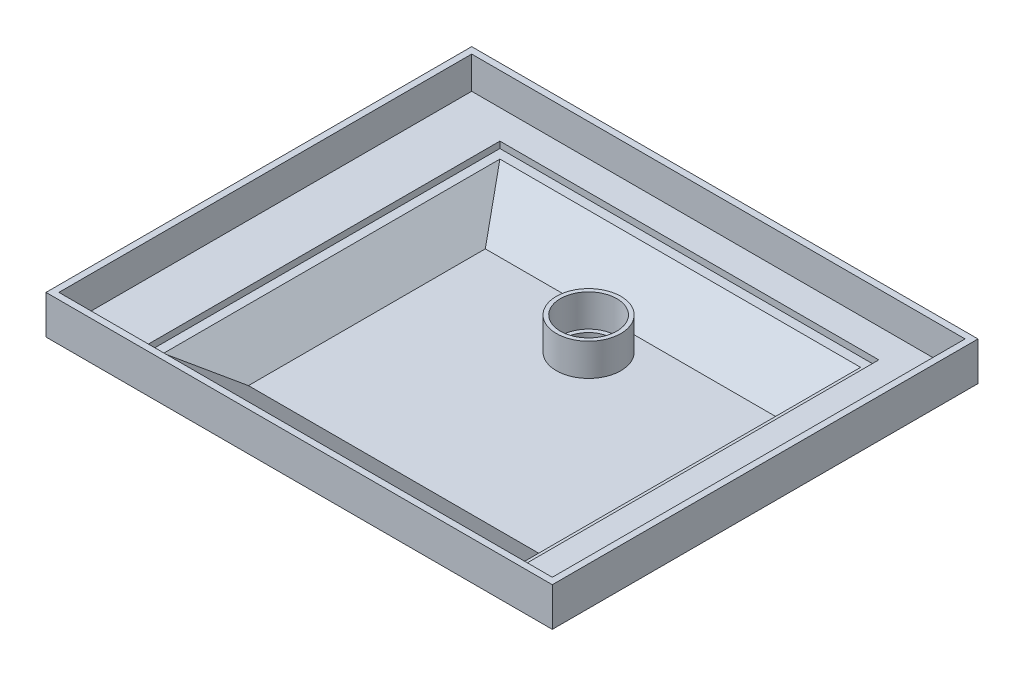
ISO-10303-21;
HEADER;
FILE_DESCRIPTION(('STEP AP214'),'2;1');
FILE_NAME('part.step','',(''),(''),'','','');
FILE_SCHEMA(('AUTOMOTIVE_DESIGN { 1 0 10303 214 1 1 1 1 }'));
ENDSEC;
DATA;
#1=APPLICATION_CONTEXT('core data for automotive mechanical design processes');
#2=APPLICATION_PROTOCOL_DEFINITION('international standard','automotive_design',2000,#1);
#3=PRODUCT_CONTEXT('',#1,'mechanical');
#4=PRODUCT('Part','Part','',(#3));
#5=PRODUCT_RELATED_PRODUCT_CATEGORY('part','',(#4));
#6=PRODUCT_DEFINITION_FORMATION('','',#4);
#7=PRODUCT_DEFINITION_CONTEXT('part definition',#1,'design');
#8=PRODUCT_DEFINITION('design','',#6,#7);
#9=PRODUCT_DEFINITION_SHAPE('','',#8);
#10=(LENGTH_UNIT() NAMED_UNIT(*) SI_UNIT(.MILLI.,.METRE.));
#11=(NAMED_UNIT(*) PLANE_ANGLE_UNIT() SI_UNIT($,.RADIAN.));
#12=(NAMED_UNIT(*) SI_UNIT($,.STERADIAN.) SOLID_ANGLE_UNIT());
#13=UNCERTAINTY_MEASURE_WITH_UNIT(LENGTH_MEASURE(1.E-05),#10,'distance_accuracy_value','');
#14=(GEOMETRIC_REPRESENTATION_CONTEXT(3) GLOBAL_UNCERTAINTY_ASSIGNED_CONTEXT((#13)) GLOBAL_UNIT_ASSIGNED_CONTEXT((#10,
#11,#12)) REPRESENTATION_CONTEXT('',''));
#15=CARTESIAN_POINT('',(0.,0.,0.));
#16=DIRECTION('',(0.,0.,1.));
#17=DIRECTION('',(1.,0.,0.));
#18=AXIS2_PLACEMENT_3D('',#15,#16,#17);
#19=CARTESIAN_POINT('',(-90.0000000000007,-21.8431457505076,-110.));
#20=DIRECTION('',(0.,-1.,0.));
#21=DIRECTION('',(1.,0.,0.));
#22=AXIS2_PLACEMENT_3D('',#19,#20,#21);
#23=PLANE('',#22);
#24=CARTESIAN_POINT('',(-2.49999999999999,-21.8431457505076,-49.8431348352473));
#25=DIRECTION('',(0.,-1.,0.));
#26=DIRECTION('',(1.,0.,0.));
#27=AXIS2_PLACEMENT_3D('',#24,#25,#26);
#28=CIRCLE('',#27,15.);
#29=CARTESIAN_POINT('',(12.5,-21.8431457505076,-49.8431348352473));
#30=VERTEX_POINT('',#29);
#31=EDGE_CURVE('E358',#30,#30,#28,.T.);
#32=ORIENTED_EDGE('',*,*,#31,.T.);
#33=EDGE_LOOP('',(#32));
#34=FACE_BOUND('',#33,.T.);
#35=CARTESIAN_POINT('',(-2.49999999999999,-21.8431457505075,-50.));
#36=DIRECTION('',(0.,1.,0.));
#37=DIRECTION('',(-1.,0.,0.));
#38=AXIS2_PLACEMENT_3D('',#35,#36,#37);
#39=CIRCLE('',#38,17.5);
#40=CARTESIAN_POINT('',(-20.,-21.8431457505075,-50.));
#41=VERTEX_POINT('',#40);
#42=EDGE_CURVE('E370',#41,#41,#39,.T.);
#43=ORIENTED_EDGE('',*,*,#42,.T.);
#44=EDGE_LOOP('',(#43));
#45=FACE_BOUND('',#44,.T.);
#46=ADVANCED_FACE('F49',(#34,#45),#23,.F.);
#47=CARTESIAN_POINT('',(-111.843145750508,0.,-110.));
#48=DIRECTION('',(-0.707106781186557,-0.707106781186538,0.));
#49=DIRECTION('',(0.707106781186538,-0.707106781186557,0.));
#50=AXIS2_PLACEMENT_3D('',#47,#48,#49);
#51=PLANE('',#50);
#52=DIRECTION('',(-0.499999999999987,0.500000000000001,-0.707106781186556));
#53=VECTOR('',#52,1.);
#54=CARTESIAN_POINT('',(-113.257859312881,1.41471356237305,-106.340707106781));
#55=LINE('',#54,#53);
#56=CARTESIAN_POINT('',(-90.0000000000007,-21.8431457505076,-73.4491270347397));
#57=VERTEX_POINT('',#56);
#58=CARTESIAN_POINT('',(-111.843145750508,0.,-104.34));
#59=VERTEX_POINT('',#58);
#60=EDGE_CURVE('E160',#57,#59,#55,.T.);
#61=ORIENTED_EDGE('',*,*,#60,.T.);
#62=DIRECTION('',(0.,0.,1.));
#63=VECTOR('',#62,1.);
#64=CARTESIAN_POINT('',(-111.843145750508,0.,-110.));
#65=LINE('',#64,#63);
#66=CARTESIAN_POINT('',(-111.843145750508,0.,104.34));
#67=VERTEX_POINT('',#66);
#68=EDGE_CURVE('E57',#59,#67,#65,.T.);
#69=ORIENTED_EDGE('',*,*,#68,.T.);
#70=DIRECTION('',(0.499999999999997,-0.50000000000001,-0.707106781186543));
#71=VECTOR('',#70,1.);
#72=CARTESIAN_POINT('',(-120.824234064114,8.98108831360659,117.041176897973));
#73=LINE('',#72,#71);
#74=CARTESIAN_POINT('',(-90.0000000000007,-21.8431457505076,73.449127034741));
#75=VERTEX_POINT('',#74);
#76=EDGE_CURVE('E157',#67,#75,#73,.T.);
#77=ORIENTED_EDGE('',*,*,#76,.T.);
#78=DIRECTION('',(0.,0.,1.));
#79=VECTOR('',#78,1.);
#80=CARTESIAN_POINT('',(-90.0000000000007,-21.8431457505076,-110.));
#81=LINE('',#80,#79);
#82=EDGE_CURVE('E152',#57,#75,#81,.T.);
#83=ORIENTED_EDGE('',*,*,#82,.F.);
#84=EDGE_LOOP('',(#61,#69,#77,#83));
#85=FACE_BOUND('',#84,.T.);
#86=ADVANCED_FACE('F51',(#85),#51,.F.);
#87=CARTESIAN_POINT('',(-2.49999999999999,-21.8431457505075,-50.));
#88=DIRECTION('',(0.,-1.,0.));
#89=DIRECTION('',(1.,0.,0.));
#90=AXIS2_PLACEMENT_3D('',#87,#88,#89);
#91=CIRCLE('',#90,20.);
#92=CARTESIAN_POINT('',(17.5,-21.8431457505075,-50.));
#93=VERTEX_POINT('',#92);
#94=EDGE_CURVE('E12',#93,#93,#91,.F.);
#95=ORIENTED_EDGE('',*,*,#94,.F.);
#96=EDGE_LOOP('',(#95));
#97=FACE_BOUND('',#96,.T.);
#98=DIRECTION('',(1.,0.,0.));
#99=VECTOR('',#98,1.);
#100=CARTESIAN_POINT('',(-139.345145750508,-21.8431457505075,-73.4491270347397));
#101=LINE('',#100,#99);
#102=CARTESIAN_POINT('',(89.9999999999994,-21.8431457505075,-73.4491270347397));
#103=VERTEX_POINT('',#102);
#104=EDGE_CURVE('E64',#57,#103,#101,.T.);
#105=ORIENTED_EDGE('',*,*,#104,.F.);
#106=ORIENTED_EDGE('',*,*,#82,.T.);
#107=DIRECTION('',(1.,0.,0.));
#108=VECTOR('',#107,1.);
#109=CARTESIAN_POINT('',(-169.610644755442,-21.8431457505075,73.4491270347409));
#110=LINE('',#109,#108);
#111=CARTESIAN_POINT('',(89.9999999999994,-21.8431457505075,73.449127034741));
#112=VERTEX_POINT('',#111);
#113=EDGE_CURVE('E171',#75,#112,#110,.T.);
#114=ORIENTED_EDGE('',*,*,#113,.T.);
#115=DIRECTION('',(0.,0.,1.));
#116=VECTOR('',#115,1.);
#117=CARTESIAN_POINT('',(89.9999999999994,-21.8431457505075,-110.));
#118=LINE('',#117,#116);
#119=EDGE_CURVE('E150',#103,#112,#118,.T.);
#120=ORIENTED_EDGE('',*,*,#119,.F.);
#121=EDGE_LOOP('',(#105,#106,#114,#120));
#122=FACE_BOUND('',#121,.T.);
#123=ADVANCED_FACE('F205',(#97,#122),#23,.F.);
#124=CARTESIAN_POINT('',(89.9999999999994,-21.8431457505075,-110.));
#125=DIRECTION('',(0.707106781186538,-0.707106781186557,0.));
#126=DIRECTION('',(0.707106781186557,0.707106781186538,0.));
#127=AXIS2_PLACEMENT_3D('',#124,#125,#126);
#128=PLANE('',#127);
#129=DIRECTION('',(0.500000000000007,0.499999999999994,-0.707106781186547));
#130=VECTOR('',#129,1.);
#131=CARTESIAN_POINT('',(111.843145750508,0.,-104.34));
#132=LINE('',#131,#130);
#133=CARTESIAN_POINT('',(111.843145750508,0.,-104.34));
#134=VERTEX_POINT('',#133);
#135=EDGE_CURVE('E72',#103,#134,#132,.T.);
#136=ORIENTED_EDGE('',*,*,#135,.F.);
#137=ORIENTED_EDGE('',*,*,#119,.T.);
#138=DIRECTION('',(-0.500000000000017,-0.500000000000004,-0.707106781186533));
#139=VECTOR('',#138,1.);
#140=CARTESIAN_POINT('',(111.843145750508,0.,104.34));
#141=LINE('',#140,#139);
#142=CARTESIAN_POINT('',(111.843145750508,0.,104.34));
#143=VERTEX_POINT('',#142);
#144=EDGE_CURVE('E177',#143,#112,#141,.T.);
#145=ORIENTED_EDGE('',*,*,#144,.F.);
#146=DIRECTION('',(0.,0.,1.));
#147=VECTOR('',#146,1.);
#148=CARTESIAN_POINT('',(111.843145750508,0.,-110.));
#149=LINE('',#148,#147);
#150=EDGE_CURVE('E148',#134,#143,#149,.T.);
#151=ORIENTED_EDGE('',*,*,#150,.F.);
#152=EDGE_LOOP('',(#136,#137,#145,#151));
#153=FACE_BOUND('',#152,.T.);
#154=ADVANCED_FACE('F213',(#153),#128,.F.);
#155=CARTESIAN_POINT('',(111.843145750508,0.,-110.));
#156=DIRECTION('',(0.,-1.,0.));
#157=DIRECTION('',(0.,0.,-1.));
#158=AXIS2_PLACEMENT_3D('',#155,#156,#157);
#159=PLANE('',#158);
#160=ORIENTED_EDGE('',*,*,#68,.F.);
#161=DIRECTION('',(1.,0.,0.));
#162=VECTOR('',#161,1.);
#163=CARTESIAN_POINT('',(-117.502,0.,-104.34));
#164=LINE('',#163,#162);
#165=EDGE_CURVE('E368',#59,#134,#164,.T.);
#166=ORIENTED_EDGE('',*,*,#165,.T.);
#167=ORIENTED_EDGE('',*,*,#150,.T.);
#168=DIRECTION('',(1.,0.,0.));
#169=VECTOR('',#168,1.);
#170=CARTESIAN_POINT('',(-147.767499004934,0.,104.34));
#171=LINE('',#170,#169);
#172=EDGE_CURVE('E169',#67,#143,#171,.T.);
#173=ORIENTED_EDGE('',*,*,#172,.F.);
#174=EDGE_LOOP('',(#160,#166,#167,#173));
#175=FACE_BOUND('',#174,.T.);
#176=DIRECTION('',(1.,0.,0.));
#177=VECTOR('',#176,1.);
#178=CARTESIAN_POINT('',(111.843145750508,0.,110.));
#179=LINE('',#178,#177);
#180=CARTESIAN_POINT('',(-117.5,0.,110.));
#181=VERTEX_POINT('',#180);
#182=CARTESIAN_POINT('',(117.5,0.,110.));
#183=VERTEX_POINT('',#182);
#184=EDGE_CURVE('E188',#181,#183,#179,.T.);
#185=ORIENTED_EDGE('',*,*,#184,.T.);
#186=DIRECTION('',(0.,0.,1.));
#187=VECTOR('',#186,1.);
#188=CARTESIAN_POINT('',(117.5,0.,-110.));
#189=LINE('',#188,#187);
#190=CARTESIAN_POINT('',(117.5,0.,-110.));
#191=VERTEX_POINT('',#190);
#192=EDGE_CURVE('E140',#191,#183,#189,.T.);
#193=ORIENTED_EDGE('',*,*,#192,.F.);
#194=DIRECTION('',(1.,0.,0.));
#195=VECTOR('',#194,1.);
#196=CARTESIAN_POINT('',(-117.5,0.,-110.));
#197=LINE('',#196,#195);
#198=CARTESIAN_POINT('',(-117.5,0.,-110.));
#199=VERTEX_POINT('',#198);
#200=EDGE_CURVE('E142',#199,#191,#197,.T.);
#201=ORIENTED_EDGE('',*,*,#200,.F.);
#202=DIRECTION('',(0.,0.,1.));
#203=VECTOR('',#202,1.);
#204=CARTESIAN_POINT('',(-117.5,0.,-110.));
#205=LINE('',#204,#203);
#206=EDGE_CURVE('E132',#199,#181,#205,.T.);
#207=ORIENTED_EDGE('',*,*,#206,.T.);
#208=EDGE_LOOP('',(#185,#193,#201,#207));
#209=FACE_BOUND('',#208,.T.);
#210=ADVANCED_FACE('F174',(#175,#209),#159,.F.);
#211=CARTESIAN_POINT('',(117.5,0.,-110.));
#212=DIRECTION('',(-0.707106781186538,0.707106781186557,0.));
#213=DIRECTION('',(-0.707106781186557,-0.707106781186538,0.));
#214=AXIS2_PLACEMENT_3D('',#211,#212,#213);
#215=PLANE('',#214);
#216=DIRECTION('',(0.,0.,1.));
#217=VECTOR('',#216,1.);
#218=CARTESIAN_POINT('',(91.6568542494918,-25.8431457505075,-110.));
#219=LINE('',#218,#217);
#220=CARTESIAN_POINT('',(91.6568542494918,-25.8431457505075,-73.4522727852473));
#221=VERTEX_POINT('',#220);
#222=CARTESIAN_POINT('',(91.6568542494918,-25.8431457505075,73.4522727852489));
#223=VERTEX_POINT('',#222);
#224=EDGE_CURVE('E138',#221,#223,#219,.T.);
#225=ORIENTED_EDGE('',*,*,#224,.F.);
#226=DIRECTION('',(0.500000000000007,0.499999999999994,-0.707106781186546));
#227=VECTOR('',#226,1.);
#228=CARTESIAN_POINT('',(117.5,0.,-110.));
#229=LINE('',#228,#227);
#230=EDGE_CURVE('E119',#221,#191,#229,.T.);
#231=ORIENTED_EDGE('',*,*,#230,.T.);
#232=ORIENTED_EDGE('',*,*,#192,.T.);
#233=DIRECTION('',(-0.500000000000018,-0.500000000000004,-0.707106781186532));
#234=VECTOR('',#233,1.);
#235=CARTESIAN_POINT('',(39.7182540694787,-77.7817459305192,4.91273688396632E-12));
#236=LINE('',#235,#234);
#237=EDGE_CURVE('E124',#183,#223,#236,.T.);
#238=ORIENTED_EDGE('',*,*,#237,.T.);
#239=EDGE_LOOP('',(#225,#231,#232,#238));
#240=FACE_BOUND('',#239,.T.);
#241=ADVANCED_FACE('F193',(#240),#215,.F.);
#242=CARTESIAN_POINT('',(-91.6568542494932,-25.8431457505075,-110.));
#243=DIRECTION('',(0.,1.,0.));
#244=DIRECTION('',(-1.,0.,0.));
#245=AXIS2_PLACEMENT_3D('',#242,#243,#244);
#246=PLANE('',#245);
#247=CARTESIAN_POINT('',(-2.49999999999999,-25.8431457505075,-49.8431348352473));
#248=DIRECTION('',(0.,-1.,0.));
#249=DIRECTION('',(1.,0.,0.));
#250=AXIS2_PLACEMENT_3D('',#247,#248,#249);
#251=CIRCLE('',#250,15.);
#252=CARTESIAN_POINT('',(12.5,-25.8431457505075,-49.8431348352473));
#253=VERTEX_POINT('',#252);
#254=EDGE_CURVE('E357',#253,#253,#251,.T.);
#255=ORIENTED_EDGE('',*,*,#254,.F.);
#256=EDGE_LOOP('',(#255));
#257=FACE_BOUND('',#256,.T.);
#258=DIRECTION('',(0.,0.,1.));
#259=VECTOR('',#258,1.);
#260=CARTESIAN_POINT('',(-91.6568542494932,-25.8431457505075,-110.));
#261=LINE('',#260,#259);
#262=CARTESIAN_POINT('',(-91.6568542494933,-25.8431457505075,-73.4522727852473));
#263=VERTEX_POINT('',#262);
#264=CARTESIAN_POINT('',(-91.6568542494932,-25.8431457505075,73.4522727852489));
#265=VERTEX_POINT('',#264);
#266=EDGE_CURVE('E130',#263,#265,#261,.T.);
#267=ORIENTED_EDGE('',*,*,#266,.F.);
#268=DIRECTION('',(-1.,0.,0.));
#269=VECTOR('',#268,1.);
#270=CARTESIAN_POINT('',(721.343145750507,-25.8431457505075,-73.4522727852473));
#271=LINE('',#270,#269);
#272=EDGE_CURVE('E113',#221,#263,#271,.T.);
#273=ORIENTED_EDGE('',*,*,#272,.F.);
#274=ORIENTED_EDGE('',*,*,#224,.T.);
#275=DIRECTION('',(-1.,0.,0.));
#276=VECTOR('',#275,1.);
#277=CARTESIAN_POINT('',(721.343145750507,-25.8431457505075,73.4522727852489));
#278=LINE('',#277,#276);
#279=EDGE_CURVE('E134',#223,#265,#278,.T.);
#280=ORIENTED_EDGE('',*,*,#279,.T.);
#281=EDGE_LOOP('',(#267,#273,#274,#280));
#282=FACE_BOUND('',#281,.T.);
#283=ADVANCED_FACE('F137',(#257,#282),#246,.F.);
#284=CARTESIAN_POINT('',(-117.5,0.,-110.));
#285=DIRECTION('',(0.707106781186557,0.707106781186538,0.));
#286=DIRECTION('',(-0.707106781186538,0.707106781186557,0.));
#287=AXIS2_PLACEMENT_3D('',#284,#285,#286);
#288=PLANE('',#287);
#289=ORIENTED_EDGE('',*,*,#206,.F.);
#290=DIRECTION('',(-0.499999999999987,0.500000000000001,-0.707106781186556));
#291=VECTOR('',#290,1.);
#292=CARTESIAN_POINT('',(-117.5,0.,-110.));
#293=LINE('',#292,#291);
#294=EDGE_CURVE('E116',#263,#199,#293,.T.);
#295=ORIENTED_EDGE('',*,*,#294,.F.);
#296=ORIENTED_EDGE('',*,*,#266,.T.);
#297=DIRECTION('',(0.499999999999998,-0.500000000000011,-0.707106781186541));
#298=VECTOR('',#297,1.);
#299=CARTESIAN_POINT('',(-117.5,0.,110.));
#300=LINE('',#299,#298);
#301=EDGE_CURVE('E172',#181,#265,#300,.T.);
#302=ORIENTED_EDGE('',*,*,#301,.F.);
#303=EDGE_LOOP('',(#289,#295,#296,#302));
#304=FACE_BOUND('',#303,.T.);
#305=ADVANCED_FACE('F128',(#304),#288,.F.);
#306=CARTESIAN_POINT('',(695.5,0.,110.));
#307=DIRECTION('',(0.,0.816496580927718,-0.577350269189638));
#308=DIRECTION('',(0.,0.577350269189638,0.816496580927718));
#309=AXIS2_PLACEMENT_3D('',#306,#307,#308);
#310=PLANE('',#309);
#311=ORIENTED_EDGE('',*,*,#184,.F.);
#312=ORIENTED_EDGE('',*,*,#301,.T.);
#313=ORIENTED_EDGE('',*,*,#279,.F.);
#314=ORIENTED_EDGE('',*,*,#237,.F.);
#315=EDGE_LOOP('',(#311,#312,#313,#314));
#316=FACE_BOUND('',#315,.T.);
#317=ADVANCED_FACE('F194',(#316),#310,.F.);
#318=CARTESIAN_POINT('',(695.5,0.,-110.));
#319=DIRECTION('',(0.,0.816496580927729,0.577350269189622));
#320=DIRECTION('',(0.,-0.577350269189622,0.816496580927729));
#321=AXIS2_PLACEMENT_3D('',#318,#319,#320);
#322=PLANE('',#321);
#323=ORIENTED_EDGE('',*,*,#200,.T.);
#324=ORIENTED_EDGE('',*,*,#230,.F.);
#325=ORIENTED_EDGE('',*,*,#272,.T.);
#326=ORIENTED_EDGE('',*,*,#294,.T.);
#327=EDGE_LOOP('',(#323,#324,#325,#326));
#328=FACE_BOUND('',#327,.T.);
#329=ADVANCED_FACE('F115',(#328),#322,.F.);
#330=CARTESIAN_POINT('',(-147.767499004934,0.,104.34));
#331=DIRECTION('',(0.,-0.816496580927718,0.577350269189637));
#332=DIRECTION('',(0.,-0.577350269189637,-0.816496580927718));
#333=AXIS2_PLACEMENT_3D('',#330,#331,#332);
#334=PLANE('',#333);
#335=ORIENTED_EDGE('',*,*,#76,.F.);
#336=ORIENTED_EDGE('',*,*,#172,.T.);
#337=ORIENTED_EDGE('',*,*,#144,.T.);
#338=ORIENTED_EDGE('',*,*,#113,.F.);
#339=EDGE_LOOP('',(#335,#336,#337,#338));
#340=FACE_BOUND('',#339,.T.);
#341=ADVANCED_FACE('F167',(#340),#334,.F.);
#342=CARTESIAN_POINT('',(-117.502,0.,-104.34));
#343=DIRECTION('',(0.,-0.816496580927729,-0.577350269189621));
#344=DIRECTION('',(0.,0.577350269189622,-0.816496580927729));
#345=AXIS2_PLACEMENT_3D('',#342,#343,#344);
#346=PLANE('',#345);
#347=ORIENTED_EDGE('',*,*,#60,.F.);
#348=ORIENTED_EDGE('',*,*,#104,.T.);
#349=ORIENTED_EDGE('',*,*,#135,.T.);
#350=ORIENTED_EDGE('',*,*,#165,.F.);
#351=EDGE_LOOP('',(#347,#348,#349,#350));
#352=FACE_BOUND('',#351,.T.);
#353=ADVANCED_FACE('F239',(#352),#346,.F.);
#354=CARTESIAN_POINT('',(-2.49999999999991,797.156854249493,-49.8431348352473));
#355=DIRECTION('',(0.,-1.,0.));
#356=DIRECTION('',(1.,0.,0.));
#357=AXIS2_PLACEMENT_3D('',#354,#355,#356);
#358=CYLINDRICAL_SURFACE('',#357,15.);
#359=ORIENTED_EDGE('',*,*,#254,.T.);
#360=EDGE_LOOP('',(#359));
#361=FACE_BOUND('',#360,.T.);
#362=ORIENTED_EDGE('',*,*,#31,.F.);
#363=EDGE_LOOP('',(#362));
#364=FACE_BOUND('',#363,.T.);
#365=ADVANCED_FACE('F232',(#361,#364),#358,.F.);
#366=CARTESIAN_POINT('',(-2.5,-1.84314575050753,-50.));
#367=DIRECTION('',(0.,1.,0.));
#368=DIRECTION('',(-1.,0.,0.));
#369=AXIS2_PLACEMENT_3D('',#366,#367,#368);
#370=PLANE('',#369);
#371=CARTESIAN_POINT('',(-2.5,-1.84314575050753,-50.));
#372=DIRECTION('',(0.,1.,0.));
#373=DIRECTION('',(-1.,0.,0.));
#374=AXIS2_PLACEMENT_3D('',#371,#372,#373);
#375=CIRCLE('',#374,20.);
#376=CARTESIAN_POINT('',(-22.5,-1.84314575050753,-50.));
#377=VERTEX_POINT('',#376);
#378=EDGE_CURVE('E359',#377,#377,#375,.T.);
#379=ORIENTED_EDGE('',*,*,#378,.T.);
#380=EDGE_LOOP('',(#379));
#381=FACE_BOUND('',#380,.T.);
#382=CARTESIAN_POINT('',(-2.5,-1.84314575050753,-50.));
#383=DIRECTION('',(0.,1.,0.));
#384=DIRECTION('',(-1.,0.,0.));
#385=AXIS2_PLACEMENT_3D('',#382,#383,#384);
#386=CIRCLE('',#385,17.5);
#387=CARTESIAN_POINT('',(-20.,-1.84314575050753,-50.));
#388=VERTEX_POINT('',#387);
#389=EDGE_CURVE('E363',#388,#388,#386,.T.);
#390=ORIENTED_EDGE('',*,*,#389,.F.);
#391=EDGE_LOOP('',(#390));
#392=FACE_BOUND('',#391,.T.);
#393=ADVANCED_FACE('F223',(#381,#392),#370,.T.);
#394=CARTESIAN_POINT('',(-2.5,-1.84314575050753,-50.));
#395=DIRECTION('',(0.,-1.,0.));
#396=DIRECTION('',(1.,0.,0.));
#397=AXIS2_PLACEMENT_3D('',#394,#395,#396);
#398=CYLINDRICAL_SURFACE('',#397,20.);
#399=ORIENTED_EDGE('',*,*,#378,.F.);
#400=EDGE_LOOP('',(#399));
#401=FACE_BOUND('',#400,.T.);
#402=ORIENTED_EDGE('',*,*,#94,.T.);
#403=EDGE_LOOP('',(#402));
#404=FACE_BOUND('',#403,.T.);
#405=ADVANCED_FACE('F220',(#401,#404),#398,.T.);
#406=CARTESIAN_POINT('',(-2.5,-1.84314575050753,-50.));
#407=DIRECTION('',(0.,-1.,0.));
#408=DIRECTION('',(1.,0.,0.));
#409=AXIS2_PLACEMENT_3D('',#406,#407,#408);
#410=CYLINDRICAL_SURFACE('',#409,17.5);
#411=ORIENTED_EDGE('',*,*,#389,.T.);
#412=EDGE_LOOP('',(#411));
#413=FACE_BOUND('',#412,.T.);
#414=ORIENTED_EDGE('',*,*,#42,.F.);
#415=EDGE_LOOP('',(#414));
#416=FACE_BOUND('',#415,.T.);
#417=ADVANCED_FACE('F222',(#413,#416),#410,.F.);
#418=CLOSED_SHELL('',(#46,#86,#123,#154,#210,#241,#283,#305,#317,#329,#341,#353,#365,#393,#405,#417));
#419=MANIFOLD_SOLID_BREP('B2',#418);
#420=CARTESIAN_POINT('',(0.,4.,0.));
#421=DIRECTION('',(0.,-1.,0.));
#422=DIRECTION('',(0.,0.,-1.));
#423=AXIS2_PLACEMENT_3D('',#420,#421,#422);
#424=PLANE('',#423);
#425=DIRECTION('',(0.,0.,-1.));
#426=VECTOR('',#425,1.);
#427=CARTESIAN_POINT('',(153.,4.,128.));
#428=LINE('',#427,#426);
#429=CARTESIAN_POINT('',(153.,4.,128.));
#430=VERTEX_POINT('',#429);
#431=CARTESIAN_POINT('',(153.,4.,-128.));
#432=VERTEX_POINT('',#431);
#433=EDGE_CURVE('E508',#430,#432,#428,.T.);
#434=ORIENTED_EDGE('',*,*,#433,.T.);
#435=DIRECTION('',(-1.,0.,0.));
#436=VECTOR('',#435,1.);
#437=CARTESIAN_POINT('',(-153.,4.,-128.));
#438=LINE('',#437,#436);
#439=CARTESIAN_POINT('',(-153.,4.,-128.));
#440=VERTEX_POINT('',#439);
#441=EDGE_CURVE('E512',#432,#440,#438,.T.);
#442=ORIENTED_EDGE('',*,*,#441,.T.);
#443=DIRECTION('',(0.,0.,1.));
#444=VECTOR('',#443,1.);
#445=CARTESIAN_POINT('',(-153.,4.,128.));
#446=LINE('',#445,#444);
#447=CARTESIAN_POINT('',(-153.,4.,128.));
#448=VERTEX_POINT('',#447);
#449=EDGE_CURVE('E517',#440,#448,#446,.T.);
#450=ORIENTED_EDGE('',*,*,#449,.T.);
#451=DIRECTION('',(1.,0.,0.));
#452=VECTOR('',#451,1.);
#453=CARTESIAN_POINT('',(-153.,4.,128.));
#454=LINE('',#453,#452);
#455=EDGE_CURVE('E521',#448,#430,#454,.T.);
#456=ORIENTED_EDGE('',*,*,#455,.T.);
#457=EDGE_LOOP('',(#434,#442,#450,#456));
#458=FACE_BOUND('',#457,.T.);
#459=DIRECTION('',(0.,0.,-1.));
#460=VECTOR('',#459,1.);
#461=CARTESIAN_POINT('',(117.5,4.,110.));
#462=LINE('',#461,#460);
#463=CARTESIAN_POINT('',(117.5,4.,110.));
#464=VERTEX_POINT('',#463);
#465=CARTESIAN_POINT('',(117.5,4.,-110.));
#466=VERTEX_POINT('',#465);
#467=EDGE_CURVE('E484',#464,#466,#462,.T.);
#468=ORIENTED_EDGE('',*,*,#467,.F.);
#469=DIRECTION('',(1.,0.,0.));
#470=VECTOR('',#469,1.);
#471=CARTESIAN_POINT('',(-117.5,4.,110.));
#472=LINE('',#471,#470);
#473=CARTESIAN_POINT('',(-117.5,4.,110.));
#474=VERTEX_POINT('',#473);
#475=EDGE_CURVE('E481',#474,#464,#472,.T.);
#476=ORIENTED_EDGE('',*,*,#475,.F.);
#477=DIRECTION('',(0.,0.,1.));
#478=VECTOR('',#477,1.);
#479=CARTESIAN_POINT('',(-117.5,4.,110.));
#480=LINE('',#479,#478);
#481=CARTESIAN_POINT('',(-117.5,4.,-110.));
#482=VERTEX_POINT('',#481);
#483=EDGE_CURVE('E399',#482,#474,#480,.T.);
#484=ORIENTED_EDGE('',*,*,#483,.F.);
#485=DIRECTION('',(-1.,0.,0.));
#486=VECTOR('',#485,1.);
#487=CARTESIAN_POINT('',(-117.5,4.,-110.));
#488=LINE('',#487,#486);
#489=EDGE_CURVE('E475',#466,#482,#488,.T.);
#490=ORIENTED_EDGE('',*,*,#489,.F.);
#491=EDGE_LOOP('',(#468,#476,#484,#490));
#492=FACE_BOUND('',#491,.T.);
#493=ADVANCED_FACE('F383',(#458,#492),#424,.F.);
#494=CARTESIAN_POINT('',(157.,24.,132.));
#495=DIRECTION('',(-1.,0.,0.));
#496=DIRECTION('',(0.,0.,1.));
#497=AXIS2_PLACEMENT_3D('',#494,#495,#496);
#498=PLANE('',#497);
#499=DIRECTION('',(0.,0.,-1.));
#500=VECTOR('',#499,1.);
#501=CARTESIAN_POINT('',(157.,0.,132.));
#502=LINE('',#501,#500);
#503=CARTESIAN_POINT('',(157.,0.,132.));
#504=VERTEX_POINT('',#503);
#505=CARTESIAN_POINT('',(157.,0.,-132.));
#506=VERTEX_POINT('',#505);
#507=EDGE_CURVE('E542',#504,#506,#502,.T.);
#508=ORIENTED_EDGE('',*,*,#507,.T.);
#509=DIRECTION('',(0.,-1.,0.));
#510=VECTOR('',#509,1.);
#511=CARTESIAN_POINT('',(157.,24.,-132.));
#512=LINE('',#511,#510);
#513=CARTESIAN_POINT('',(157.,24.,-132.));
#514=VERTEX_POINT('',#513);
#515=EDGE_CURVE('E589',#514,#506,#512,.T.);
#516=ORIENTED_EDGE('',*,*,#515,.F.);
#517=DIRECTION('',(0.,0.,-1.));
#518=VECTOR('',#517,1.);
#519=CARTESIAN_POINT('',(157.,24.,132.));
#520=LINE('',#519,#518);
#521=CARTESIAN_POINT('',(157.,24.,132.));
#522=VERTEX_POINT('',#521);
#523=EDGE_CURVE('E552',#522,#514,#520,.T.);
#524=ORIENTED_EDGE('',*,*,#523,.F.);
#525=DIRECTION('',(0.,-1.,0.));
#526=VECTOR('',#525,1.);
#527=CARTESIAN_POINT('',(157.,24.,132.));
#528=LINE('',#527,#526);
#529=EDGE_CURVE('E566',#522,#504,#528,.T.);
#530=ORIENTED_EDGE('',*,*,#529,.T.);
#531=EDGE_LOOP('',(#508,#516,#524,#530));
#532=FACE_BOUND('',#531,.T.);
#533=ADVANCED_FACE('F385',(#532),#498,.F.);
#534=CARTESIAN_POINT('',(-157.,24.,-132.));
#535=DIRECTION('',(0.,0.,1.));
#536=DIRECTION('',(1.,0.,0.));
#537=AXIS2_PLACEMENT_3D('',#534,#535,#536);
#538=PLANE('',#537);
#539=DIRECTION('',(-1.,0.,0.));
#540=VECTOR('',#539,1.);
#541=CARTESIAN_POINT('',(-157.,0.,-132.));
#542=LINE('',#541,#540);
#543=CARTESIAN_POINT('',(-157.,0.,-132.));
#544=VERTEX_POINT('',#543);
#545=EDGE_CURVE('E570',#506,#544,#542,.T.);
#546=ORIENTED_EDGE('',*,*,#545,.T.);
#547=DIRECTION('',(0.,-1.,0.));
#548=VECTOR('',#547,1.);
#549=CARTESIAN_POINT('',(-157.,24.,-132.));
#550=LINE('',#549,#548);
#551=CARTESIAN_POINT('',(-157.,24.,-132.));
#552=VERTEX_POINT('',#551);
#553=EDGE_CURVE('E585',#552,#544,#550,.T.);
#554=ORIENTED_EDGE('',*,*,#553,.F.);
#555=DIRECTION('',(-1.,0.,0.));
#556=VECTOR('',#555,1.);
#557=CARTESIAN_POINT('',(-157.,24.,-132.));
#558=LINE('',#557,#556);
#559=EDGE_CURVE('E556',#514,#552,#558,.T.);
#560=ORIENTED_EDGE('',*,*,#559,.F.);
#561=ORIENTED_EDGE('',*,*,#515,.T.);
#562=EDGE_LOOP('',(#546,#554,#560,#561));
#563=FACE_BOUND('',#562,.T.);
#564=ADVANCED_FACE('F626',(#563),#538,.F.);
#565=CARTESIAN_POINT('',(-157.,24.,132.));
#566=DIRECTION('',(1.,0.,0.));
#567=DIRECTION('',(0.,0.,-1.));
#568=AXIS2_PLACEMENT_3D('',#565,#566,#567);
#569=PLANE('',#568);
#570=DIRECTION('',(0.,0.,1.));
#571=VECTOR('',#570,1.);
#572=CARTESIAN_POINT('',(-157.,0.,132.));
#573=LINE('',#572,#571);
#574=CARTESIAN_POINT('',(-157.,0.,132.));
#575=VERTEX_POINT('',#574);
#576=EDGE_CURVE('E573',#544,#575,#573,.T.);
#577=ORIENTED_EDGE('',*,*,#576,.T.);
#578=DIRECTION('',(0.,-1.,0.));
#579=VECTOR('',#578,1.);
#580=CARTESIAN_POINT('',(-157.,24.,132.));
#581=LINE('',#580,#579);
#582=CARTESIAN_POINT('',(-157.,24.,132.));
#583=VERTEX_POINT('',#582);
#584=EDGE_CURVE('E581',#583,#575,#581,.T.);
#585=ORIENTED_EDGE('',*,*,#584,.F.);
#586=DIRECTION('',(0.,0.,1.));
#587=VECTOR('',#586,1.);
#588=CARTESIAN_POINT('',(-157.,24.,132.));
#589=LINE('',#588,#587);
#590=EDGE_CURVE('E560',#552,#583,#589,.T.);
#591=ORIENTED_EDGE('',*,*,#590,.F.);
#592=ORIENTED_EDGE('',*,*,#553,.T.);
#593=EDGE_LOOP('',(#577,#585,#591,#592));
#594=FACE_BOUND('',#593,.T.);
#595=ADVANCED_FACE('F623',(#594),#569,.F.);
#596=CARTESIAN_POINT('',(-157.,24.,132.));
#597=DIRECTION('',(0.,0.,-1.));
#598=DIRECTION('',(-1.,0.,0.));
#599=AXIS2_PLACEMENT_3D('',#596,#597,#598);
#600=PLANE('',#599);
#601=DIRECTION('',(1.,0.,0.));
#602=VECTOR('',#601,1.);
#603=CARTESIAN_POINT('',(-157.,0.,132.));
#604=LINE('',#603,#602);
#605=EDGE_CURVE('E557',#575,#504,#604,.T.);
#606=ORIENTED_EDGE('',*,*,#605,.T.);
#607=ORIENTED_EDGE('',*,*,#529,.F.);
#608=DIRECTION('',(1.,0.,0.));
#609=VECTOR('',#608,1.);
#610=CARTESIAN_POINT('',(-157.,24.,132.));
#611=LINE('',#610,#609);
#612=EDGE_CURVE('E563',#583,#522,#611,.T.);
#613=ORIENTED_EDGE('',*,*,#612,.F.);
#614=ORIENTED_EDGE('',*,*,#584,.T.);
#615=EDGE_LOOP('',(#606,#607,#613,#614));
#616=FACE_BOUND('',#615,.T.);
#617=ADVANCED_FACE('F619',(#616),#600,.F.);
#618=CARTESIAN_POINT('',(0.,24.,0.));
#619=DIRECTION('',(0.,-1.,0.));
#620=DIRECTION('',(0.,0.,-1.));
#621=AXIS2_PLACEMENT_3D('',#618,#619,#620);
#622=PLANE('',#621);
#623=DIRECTION('',(-1.,0.,0.));
#624=VECTOR('',#623,1.);
#625=CARTESIAN_POINT('',(-153.,24.,-128.));
#626=LINE('',#625,#624);
#627=CARTESIAN_POINT('',(153.,24.,-128.));
#628=VERTEX_POINT('',#627);
#629=CARTESIAN_POINT('',(-153.,24.,-128.));
#630=VERTEX_POINT('',#629);
#631=EDGE_CURVE('E528',#628,#630,#626,.T.);
#632=ORIENTED_EDGE('',*,*,#631,.F.);
#633=DIRECTION('',(0.,0.,-1.));
#634=VECTOR('',#633,1.);
#635=CARTESIAN_POINT('',(153.,24.,128.));
#636=LINE('',#635,#634);
#637=CARTESIAN_POINT('',(153.,24.,128.));
#638=VERTEX_POINT('',#637);
#639=EDGE_CURVE('E502',#638,#628,#636,.T.);
#640=ORIENTED_EDGE('',*,*,#639,.F.);
#641=DIRECTION('',(1.,0.,0.));
#642=VECTOR('',#641,1.);
#643=CARTESIAN_POINT('',(-153.,24.,128.));
#644=LINE('',#643,#642);
#645=CARTESIAN_POINT('',(-153.,24.,128.));
#646=VERTEX_POINT('',#645);
#647=EDGE_CURVE('E513',#646,#638,#644,.T.);
#648=ORIENTED_EDGE('',*,*,#647,.F.);
#649=DIRECTION('',(0.,0.,1.));
#650=VECTOR('',#649,1.);
#651=CARTESIAN_POINT('',(-153.,24.,128.));
#652=LINE('',#651,#650);
#653=EDGE_CURVE('E532',#630,#646,#652,.T.);
#654=ORIENTED_EDGE('',*,*,#653,.F.);
#655=EDGE_LOOP('',(#632,#640,#648,#654));
#656=FACE_BOUND('',#655,.T.);
#657=ORIENTED_EDGE('',*,*,#523,.T.);
#658=ORIENTED_EDGE('',*,*,#559,.T.);
#659=ORIENTED_EDGE('',*,*,#590,.T.);
#660=ORIENTED_EDGE('',*,*,#612,.T.);
#661=EDGE_LOOP('',(#657,#658,#659,#660));
#662=FACE_BOUND('',#661,.T.);
#663=ADVANCED_FACE('F608',(#656,#662),#622,.F.);
#664=CARTESIAN_POINT('',(0.,0.,0.));
#665=DIRECTION('',(0.,-1.,0.));
#666=DIRECTION('',(0.,0.,-1.));
#667=AXIS2_PLACEMENT_3D('',#664,#665,#666);
#668=PLANE('',#667);
#669=DIRECTION('',(0.,0.,1.));
#670=VECTOR('',#669,1.);
#671=CARTESIAN_POINT('',(117.5,0.,0.));
#672=LINE('',#671,#670);
#673=CARTESIAN_POINT('',(117.5,0.,-110.));
#674=VERTEX_POINT('',#673);
#675=CARTESIAN_POINT('',(117.5,0.,110.));
#676=VERTEX_POINT('',#675);
#677=EDGE_CURVE('E47',#674,#676,#672,.T.);
#678=ORIENTED_EDGE('',*,*,#677,.F.);
#679=DIRECTION('',(1.,0.,0.));
#680=VECTOR('',#679,1.);
#681=CARTESIAN_POINT('',(0.,0.,-110.));
#682=LINE('',#681,#680);
#683=CARTESIAN_POINT('',(-117.5,0.,-110.));
#684=VERTEX_POINT('',#683);
#685=EDGE_CURVE('E477',#684,#674,#682,.T.);
#686=ORIENTED_EDGE('',*,*,#685,.F.);
#687=DIRECTION('',(0.,0.,-1.));
#688=VECTOR('',#687,1.);
#689=CARTESIAN_POINT('',(-117.5,0.,0.));
#690=LINE('',#689,#688);
#691=CARTESIAN_POINT('',(-117.5,0.,110.));
#692=VERTEX_POINT('',#691);
#693=EDGE_CURVE('E595',#692,#684,#690,.T.);
#694=ORIENTED_EDGE('',*,*,#693,.F.);
#695=DIRECTION('',(-1.,0.,0.));
#696=VECTOR('',#695,1.);
#697=CARTESIAN_POINT('',(0.,0.,110.));
#698=LINE('',#697,#696);
#699=EDGE_CURVE('E392',#676,#692,#698,.T.);
#700=ORIENTED_EDGE('',*,*,#699,.F.);
#701=EDGE_LOOP('',(#678,#686,#694,#700));
#702=FACE_BOUND('',#701,.T.);
#703=ORIENTED_EDGE('',*,*,#507,.F.);
#704=ORIENTED_EDGE('',*,*,#605,.F.);
#705=ORIENTED_EDGE('',*,*,#576,.F.);
#706=ORIENTED_EDGE('',*,*,#545,.F.);
#707=EDGE_LOOP('',(#703,#704,#705,#706));
#708=FACE_BOUND('',#707,.T.);
#709=ADVANCED_FACE('F604',(#702,#708),#668,.T.);
#710=CARTESIAN_POINT('',(153.,4.,128.));
#711=DIRECTION('',(1.,0.,0.));
#712=DIRECTION('',(0.,0.,-1.));
#713=AXIS2_PLACEMENT_3D('',#710,#711,#712);
#714=PLANE('',#713);
#715=ORIENTED_EDGE('',*,*,#639,.T.);
#716=DIRECTION('',(0.,1.,0.));
#717=VECTOR('',#716,1.);
#718=CARTESIAN_POINT('',(153.,4.,-128.));
#719=LINE('',#718,#717);
#720=EDGE_CURVE('E525',#432,#628,#719,.T.);
#721=ORIENTED_EDGE('',*,*,#720,.F.);
#722=ORIENTED_EDGE('',*,*,#433,.F.);
#723=DIRECTION('',(0.,1.,0.));
#724=VECTOR('',#723,1.);
#725=CARTESIAN_POINT('',(153.,4.,128.));
#726=LINE('',#725,#724);
#727=EDGE_CURVE('E539',#430,#638,#726,.T.);
#728=ORIENTED_EDGE('',*,*,#727,.T.);
#729=EDGE_LOOP('',(#715,#721,#722,#728));
#730=FACE_BOUND('',#729,.T.);
#731=ADVANCED_FACE('F607',(#730),#714,.F.);
#732=CARTESIAN_POINT('',(-153.,4.,128.));
#733=DIRECTION('',(0.,0.,1.));
#734=DIRECTION('',(1.,0.,0.));
#735=AXIS2_PLACEMENT_3D('',#732,#733,#734);
#736=PLANE('',#735);
#737=ORIENTED_EDGE('',*,*,#647,.T.);
#738=ORIENTED_EDGE('',*,*,#727,.F.);
#739=ORIENTED_EDGE('',*,*,#455,.F.);
#740=DIRECTION('',(0.,1.,0.));
#741=VECTOR('',#740,1.);
#742=CARTESIAN_POINT('',(-153.,4.,128.));
#743=LINE('',#742,#741);
#744=EDGE_CURVE('E543',#448,#646,#743,.T.);
#745=ORIENTED_EDGE('',*,*,#744,.T.);
#746=EDGE_LOOP('',(#737,#738,#739,#745));
#747=FACE_BOUND('',#746,.T.);
#748=ADVANCED_FACE('F646',(#747),#736,.F.);
#749=CARTESIAN_POINT('',(-153.,4.,128.));
#750=DIRECTION('',(-1.,0.,0.));
#751=DIRECTION('',(0.,0.,1.));
#752=AXIS2_PLACEMENT_3D('',#749,#750,#751);
#753=PLANE('',#752);
#754=ORIENTED_EDGE('',*,*,#653,.T.);
#755=ORIENTED_EDGE('',*,*,#744,.F.);
#756=ORIENTED_EDGE('',*,*,#449,.F.);
#757=DIRECTION('',(0.,1.,0.));
#758=VECTOR('',#757,1.);
#759=CARTESIAN_POINT('',(-153.,4.,-128.));
#760=LINE('',#759,#758);
#761=EDGE_CURVE('E546',#440,#630,#760,.T.);
#762=ORIENTED_EDGE('',*,*,#761,.T.);
#763=EDGE_LOOP('',(#754,#755,#756,#762));
#764=FACE_BOUND('',#763,.T.);
#765=ADVANCED_FACE('F649',(#764),#753,.F.);
#766=CARTESIAN_POINT('',(-153.,4.,-128.));
#767=DIRECTION('',(0.,0.,-1.));
#768=DIRECTION('',(-1.,0.,0.));
#769=AXIS2_PLACEMENT_3D('',#766,#767,#768);
#770=PLANE('',#769);
#771=ORIENTED_EDGE('',*,*,#631,.T.);
#772=ORIENTED_EDGE('',*,*,#761,.F.);
#773=ORIENTED_EDGE('',*,*,#441,.F.);
#774=ORIENTED_EDGE('',*,*,#720,.T.);
#775=EDGE_LOOP('',(#771,#772,#773,#774));
#776=FACE_BOUND('',#775,.T.);
#777=ADVANCED_FACE('F653',(#776),#770,.F.);
#778=CARTESIAN_POINT('',(117.5,-16.,110.));
#779=DIRECTION('',(1.,0.,0.));
#780=DIRECTION('',(0.,0.,-1.));
#781=AXIS2_PLACEMENT_3D('',#778,#779,#780);
#782=PLANE('',#781);
#783=ORIENTED_EDGE('',*,*,#677,.T.);
#784=DIRECTION('',(0.,1.,0.));
#785=VECTOR('',#784,1.);
#786=CARTESIAN_POINT('',(117.5,-16.,110.));
#787=LINE('',#786,#785);
#788=EDGE_CURVE('E487',#676,#464,#787,.T.);
#789=ORIENTED_EDGE('',*,*,#788,.T.);
#790=ORIENTED_EDGE('',*,*,#467,.T.);
#791=DIRECTION('',(0.,1.,0.));
#792=VECTOR('',#791,1.);
#793=CARTESIAN_POINT('',(117.5,-16.,-110.));
#794=LINE('',#793,#792);
#795=EDGE_CURVE('E471',#674,#466,#794,.T.);
#796=ORIENTED_EDGE('',*,*,#795,.F.);
#797=EDGE_LOOP('',(#783,#789,#790,#796));
#798=FACE_BOUND('',#797,.T.);
#799=ADVANCED_FACE('F485',(#798),#782,.F.);
#800=CARTESIAN_POINT('',(-117.5,-16.,110.));
#801=DIRECTION('',(0.,0.,1.));
#802=DIRECTION('',(1.,0.,0.));
#803=AXIS2_PLACEMENT_3D('',#800,#801,#802);
#804=PLANE('',#803);
#805=ORIENTED_EDGE('',*,*,#699,.T.);
#806=DIRECTION('',(0.,1.,0.));
#807=VECTOR('',#806,1.);
#808=CARTESIAN_POINT('',(-117.5,-16.,110.));
#809=LINE('',#808,#807);
#810=EDGE_CURVE('E503',#692,#474,#809,.T.);
#811=ORIENTED_EDGE('',*,*,#810,.T.);
#812=ORIENTED_EDGE('',*,*,#475,.T.);
#813=ORIENTED_EDGE('',*,*,#788,.F.);
#814=EDGE_LOOP('',(#805,#811,#812,#813));
#815=FACE_BOUND('',#814,.T.);
#816=ADVANCED_FACE('F600',(#815),#804,.F.);
#817=CARTESIAN_POINT('',(-117.5,-16.,110.));
#818=DIRECTION('',(-1.,0.,0.));
#819=DIRECTION('',(0.,0.,1.));
#820=AXIS2_PLACEMENT_3D('',#817,#818,#819);
#821=PLANE('',#820);
#822=ORIENTED_EDGE('',*,*,#693,.T.);
#823=DIRECTION('',(0.,1.,0.));
#824=VECTOR('',#823,1.);
#825=CARTESIAN_POINT('',(-117.5,-16.,-110.));
#826=LINE('',#825,#824);
#827=EDGE_CURVE('E406',#684,#482,#826,.T.);
#828=ORIENTED_EDGE('',*,*,#827,.T.);
#829=ORIENTED_EDGE('',*,*,#483,.T.);
#830=ORIENTED_EDGE('',*,*,#810,.F.);
#831=EDGE_LOOP('',(#822,#828,#829,#830));
#832=FACE_BOUND('',#831,.T.);
#833=ADVANCED_FACE('F603',(#832),#821,.F.);
#834=CARTESIAN_POINT('',(-117.5,-16.,-110.));
#835=DIRECTION('',(0.,0.,-1.));
#836=DIRECTION('',(-1.,0.,0.));
#837=AXIS2_PLACEMENT_3D('',#834,#835,#836);
#838=PLANE('',#837);
#839=ORIENTED_EDGE('',*,*,#685,.T.);
#840=ORIENTED_EDGE('',*,*,#795,.T.);
#841=ORIENTED_EDGE('',*,*,#489,.T.);
#842=ORIENTED_EDGE('',*,*,#827,.F.);
#843=EDGE_LOOP('',(#839,#840,#841,#842));
#844=FACE_BOUND('',#843,.T.);
#845=ADVANCED_FACE('F473',(#844),#838,.F.);
#846=CLOSED_SHELL('',(#493,#533,#564,#595,#617,#663,#709,#731,#748,#765,#777,#799,#816,#833,#845));
#847=MANIFOLD_SOLID_BREP('B6',#846);
#848=ADVANCED_BREP_SHAPE_REPRESENTATION('',(#18,#419,#847),#14);
#849=SHAPE_DEFINITION_REPRESENTATION(#9,#848);
ENDSEC;
END-ISO-10303-21;
